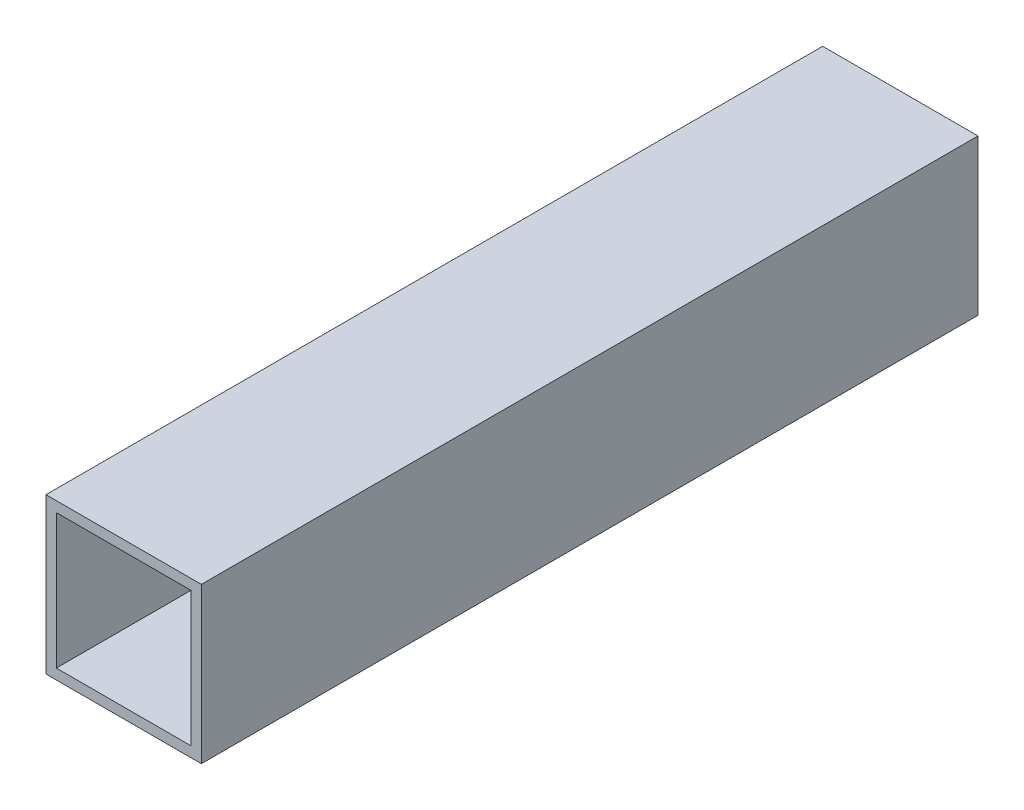
ISO-10303-21;
HEADER;
FILE_DESCRIPTION(('STEP AP214'),'2;1');
FILE_NAME('part.step','',(''),(''),'','','');
FILE_SCHEMA(('AUTOMOTIVE_DESIGN { 1 0 10303 214 1 1 1 1 }'));
ENDSEC;
DATA;
#1=APPLICATION_CONTEXT('core data for automotive mechanical design processes');
#2=APPLICATION_PROTOCOL_DEFINITION('international standard','automotive_design',2000,#1);
#3=PRODUCT_CONTEXT('',#1,'mechanical');
#4=PRODUCT('Part','Part','',(#3));
#5=PRODUCT_RELATED_PRODUCT_CATEGORY('part','',(#4));
#6=PRODUCT_DEFINITION_FORMATION('','',#4);
#7=PRODUCT_DEFINITION_CONTEXT('part definition',#1,'design');
#8=PRODUCT_DEFINITION('design','',#6,#7);
#9=PRODUCT_DEFINITION_SHAPE('','',#8);
#10=(LENGTH_UNIT() NAMED_UNIT(*) SI_UNIT(.MILLI.,.METRE.));
#11=(NAMED_UNIT(*) PLANE_ANGLE_UNIT() SI_UNIT($,.RADIAN.));
#12=(NAMED_UNIT(*) SI_UNIT($,.STERADIAN.) SOLID_ANGLE_UNIT());
#13=UNCERTAINTY_MEASURE_WITH_UNIT(LENGTH_MEASURE(1.E-05),#10,'distance_accuracy_value','');
#14=(GEOMETRIC_REPRESENTATION_CONTEXT(3) GLOBAL_UNCERTAINTY_ASSIGNED_CONTEXT((#13)) GLOBAL_UNIT_ASSIGNED_CONTEXT((#10,
#11,#12)) REPRESENTATION_CONTEXT('',''));
#15=CARTESIAN_POINT('',(0.,0.,0.));
#16=DIRECTION('',(0.,0.,1.));
#17=DIRECTION('',(1.,0.,0.));
#18=AXIS2_PLACEMENT_3D('',#15,#16,#17);
#19=CARTESIAN_POINT('',(-15.,-15.,150.));
#20=DIRECTION('',(0.,0.,1.));
#21=DIRECTION('',(1.,0.,0.));
#22=AXIS2_PLACEMENT_3D('',#19,#20,#21);
#23=PLANE('',#22);
#24=DIRECTION('',(0.,-1.,0.));
#25=VECTOR('',#24,1.);
#26=CARTESIAN_POINT('',(-15.,-15.,150.));
#27=LINE('',#26,#25);
#28=CARTESIAN_POINT('',(-15.,15.,150.));
#29=VERTEX_POINT('',#28);
#30=CARTESIAN_POINT('',(-15.,-15.,150.));
#31=VERTEX_POINT('',#30);
#32=EDGE_CURVE('E160',#29,#31,#27,.T.);
#33=ORIENTED_EDGE('',*,*,#32,.T.);
#34=DIRECTION('',(1.,0.,0.));
#35=VECTOR('',#34,1.);
#36=CARTESIAN_POINT('',(15.,-15.,150.));
#37=LINE('',#36,#35);
#38=CARTESIAN_POINT('',(15.,-15.,150.));
#39=VERTEX_POINT('',#38);
#40=EDGE_CURVE('E163',#31,#39,#37,.T.);
#41=ORIENTED_EDGE('',*,*,#40,.T.);
#42=DIRECTION('',(0.,1.,0.));
#43=VECTOR('',#42,1.);
#44=CARTESIAN_POINT('',(15.,-15.,150.));
#45=LINE('',#44,#43);
#46=CARTESIAN_POINT('',(15.,15.,150.));
#47=VERTEX_POINT('',#46);
#48=EDGE_CURVE('E166',#39,#47,#45,.T.);
#49=ORIENTED_EDGE('',*,*,#48,.T.);
#50=DIRECTION('',(-1.,0.,0.));
#51=VECTOR('',#50,1.);
#52=CARTESIAN_POINT('',(15.,15.,150.));
#53=LINE('',#52,#51);
#54=EDGE_CURVE('E168',#47,#29,#53,.T.);
#55=ORIENTED_EDGE('',*,*,#54,.T.);
#56=EDGE_LOOP('',(#33,#41,#49,#55));
#57=FACE_BOUND('',#56,.T.);
#58=DIRECTION('',(1.,0.,0.));
#59=VECTOR('',#58,1.);
#60=CARTESIAN_POINT('',(15.,-13.,150.));
#61=LINE('',#60,#59);
#62=CARTESIAN_POINT('',(-13.,-13.,150.));
#63=VERTEX_POINT('',#62);
#64=CARTESIAN_POINT('',(13.,-13.,150.));
#65=VERTEX_POINT('',#64);
#66=EDGE_CURVE('E132',#63,#65,#61,.T.);
#67=ORIENTED_EDGE('',*,*,#66,.F.);
#68=DIRECTION('',(0.,-1.,0.));
#69=VECTOR('',#68,1.);
#70=CARTESIAN_POINT('',(-13.,-15.,150.));
#71=LINE('',#70,#69);
#72=CARTESIAN_POINT('',(-13.,13.,150.));
#73=VERTEX_POINT('',#72);
#74=EDGE_CURVE('E124',#73,#63,#71,.T.);
#75=ORIENTED_EDGE('',*,*,#74,.F.);
#76=DIRECTION('',(-1.,0.,0.));
#77=VECTOR('',#76,1.);
#78=CARTESIAN_POINT('',(15.,13.,150.));
#79=LINE('',#78,#77);
#80=CARTESIAN_POINT('',(13.,13.,150.));
#81=VERTEX_POINT('',#80);
#82=EDGE_CURVE('E146',#81,#73,#79,.T.);
#83=ORIENTED_EDGE('',*,*,#82,.F.);
#84=DIRECTION('',(0.,1.,0.));
#85=VECTOR('',#84,1.);
#86=CARTESIAN_POINT('',(13.,-15.,150.));
#87=LINE('',#86,#85);
#88=EDGE_CURVE('E144',#65,#81,#87,.T.);
#89=ORIENTED_EDGE('',*,*,#88,.F.);
#90=EDGE_LOOP('',(#67,#75,#83,#89));
#91=FACE_BOUND('',#90,.T.);
#92=ADVANCED_FACE('F59',(#57,#91),#23,.T.);
#93=CARTESIAN_POINT('',(-15.,-15.,0.));
#94=DIRECTION('',(0.,0.,1.));
#95=DIRECTION('',(1.,0.,0.));
#96=AXIS2_PLACEMENT_3D('',#93,#94,#95);
#97=PLANE('',#96);
#98=DIRECTION('',(0.,-1.,0.));
#99=VECTOR('',#98,1.);
#100=CARTESIAN_POINT('',(-15.,-15.,0.));
#101=LINE('',#100,#99);
#102=CARTESIAN_POINT('',(-15.,15.,0.));
#103=VERTEX_POINT('',#102);
#104=CARTESIAN_POINT('',(-15.,-15.,0.));
#105=VERTEX_POINT('',#104);
#106=EDGE_CURVE('E140',#103,#105,#101,.T.);
#107=ORIENTED_EDGE('',*,*,#106,.F.);
#108=DIRECTION('',(-1.,0.,0.));
#109=VECTOR('',#108,1.);
#110=CARTESIAN_POINT('',(15.,15.,0.));
#111=LINE('',#110,#109);
#112=CARTESIAN_POINT('',(15.,15.,0.));
#113=VERTEX_POINT('',#112);
#114=EDGE_CURVE('E164',#113,#103,#111,.T.);
#115=ORIENTED_EDGE('',*,*,#114,.F.);
#116=DIRECTION('',(0.,1.,0.));
#117=VECTOR('',#116,1.);
#118=CARTESIAN_POINT('',(15.,-15.,0.));
#119=LINE('',#118,#117);
#120=CARTESIAN_POINT('',(15.,-15.,0.));
#121=VERTEX_POINT('',#120);
#122=EDGE_CURVE('E175',#121,#113,#119,.T.);
#123=ORIENTED_EDGE('',*,*,#122,.F.);
#124=DIRECTION('',(1.,0.,0.));
#125=VECTOR('',#124,1.);
#126=CARTESIAN_POINT('',(15.,-15.,0.));
#127=LINE('',#126,#125);
#128=EDGE_CURVE('E173',#105,#121,#127,.T.);
#129=ORIENTED_EDGE('',*,*,#128,.F.);
#130=EDGE_LOOP('',(#107,#115,#123,#129));
#131=FACE_BOUND('',#130,.T.);
#132=DIRECTION('',(0.,-1.,0.));
#133=VECTOR('',#132,1.);
#134=CARTESIAN_POINT('',(-13.,-15.,0.));
#135=LINE('',#134,#133);
#136=CARTESIAN_POINT('',(-13.,13.,0.));
#137=VERTEX_POINT('',#136);
#138=CARTESIAN_POINT('',(-13.,-13.,0.));
#139=VERTEX_POINT('',#138);
#140=EDGE_CURVE('E82',#137,#139,#135,.T.);
#141=ORIENTED_EDGE('',*,*,#140,.T.);
#142=DIRECTION('',(1.,0.,0.));
#143=VECTOR('',#142,1.);
#144=CARTESIAN_POINT('',(15.,-13.,0.));
#145=LINE('',#144,#143);
#146=CARTESIAN_POINT('',(13.,-13.,0.));
#147=VERTEX_POINT('',#146);
#148=EDGE_CURVE('E139',#139,#147,#145,.T.);
#149=ORIENTED_EDGE('',*,*,#148,.T.);
#150=DIRECTION('',(0.,1.,0.));
#151=VECTOR('',#150,1.);
#152=CARTESIAN_POINT('',(13.,-15.,0.));
#153=LINE('',#152,#151);
#154=CARTESIAN_POINT('',(13.,13.,0.));
#155=VERTEX_POINT('',#154);
#156=EDGE_CURVE('E152',#147,#155,#153,.T.);
#157=ORIENTED_EDGE('',*,*,#156,.T.);
#158=DIRECTION('',(-1.,0.,0.));
#159=VECTOR('',#158,1.);
#160=CARTESIAN_POINT('',(15.,13.,0.));
#161=LINE('',#160,#159);
#162=EDGE_CURVE('E133',#155,#137,#161,.T.);
#163=ORIENTED_EDGE('',*,*,#162,.T.);
#164=EDGE_LOOP('',(#141,#149,#157,#163));
#165=FACE_BOUND('',#164,.T.);
#166=ADVANCED_FACE('F193',(#131,#165),#97,.F.);
#167=CARTESIAN_POINT('',(-15.,-15.,150.));
#168=DIRECTION('',(1.,0.,0.));
#169=DIRECTION('',(0.,0.,-1.));
#170=AXIS2_PLACEMENT_3D('',#167,#168,#169);
#171=PLANE('',#170);
#172=ORIENTED_EDGE('',*,*,#106,.T.);
#173=DIRECTION('',(0.,0.,-1.));
#174=VECTOR('',#173,1.);
#175=CARTESIAN_POINT('',(-15.,-15.,150.));
#176=LINE('',#175,#174);
#177=EDGE_CURVE('E12',#31,#105,#176,.T.);
#178=ORIENTED_EDGE('',*,*,#177,.F.);
#179=ORIENTED_EDGE('',*,*,#32,.F.);
#180=DIRECTION('',(0.,0.,-1.));
#181=VECTOR('',#180,1.);
#182=CARTESIAN_POINT('',(-15.,15.,150.));
#183=LINE('',#182,#181);
#184=EDGE_CURVE('E170',#29,#103,#183,.T.);
#185=ORIENTED_EDGE('',*,*,#184,.T.);
#186=EDGE_LOOP('',(#172,#178,#179,#185));
#187=FACE_BOUND('',#186,.T.);
#188=ADVANCED_FACE('F61',(#187),#171,.F.);
#189=CARTESIAN_POINT('',(15.,-15.,150.));
#190=DIRECTION('',(0.,1.,0.));
#191=DIRECTION('',(-1.,0.,0.));
#192=AXIS2_PLACEMENT_3D('',#189,#190,#191);
#193=PLANE('',#192);
#194=ORIENTED_EDGE('',*,*,#128,.T.);
#195=DIRECTION('',(0.,0.,-1.));
#196=VECTOR('',#195,1.);
#197=CARTESIAN_POINT('',(15.,-15.,150.));
#198=LINE('',#197,#196);
#199=EDGE_CURVE('E67',#39,#121,#198,.T.);
#200=ORIENTED_EDGE('',*,*,#199,.F.);
#201=ORIENTED_EDGE('',*,*,#40,.F.);
#202=ORIENTED_EDGE('',*,*,#177,.T.);
#203=EDGE_LOOP('',(#194,#200,#201,#202));
#204=FACE_BOUND('',#203,.T.);
#205=ADVANCED_FACE('F203',(#204),#193,.F.);
#206=CARTESIAN_POINT('',(15.,-15.,150.));
#207=DIRECTION('',(-1.,0.,0.));
#208=DIRECTION('',(0.,0.,1.));
#209=AXIS2_PLACEMENT_3D('',#206,#207,#208);
#210=PLANE('',#209);
#211=ORIENTED_EDGE('',*,*,#122,.T.);
#212=DIRECTION('',(0.,0.,-1.));
#213=VECTOR('',#212,1.);
#214=CARTESIAN_POINT('',(15.,15.,150.));
#215=LINE('',#214,#213);
#216=EDGE_CURVE('E180',#47,#113,#215,.T.);
#217=ORIENTED_EDGE('',*,*,#216,.F.);
#218=ORIENTED_EDGE('',*,*,#48,.F.);
#219=ORIENTED_EDGE('',*,*,#199,.T.);
#220=EDGE_LOOP('',(#211,#217,#218,#219));
#221=FACE_BOUND('',#220,.T.);
#222=ADVANCED_FACE('F187',(#221),#210,.F.);
#223=CARTESIAN_POINT('',(15.,15.,150.));
#224=DIRECTION('',(0.,-1.,0.));
#225=DIRECTION('',(1.,0.,0.));
#226=AXIS2_PLACEMENT_3D('',#223,#224,#225);
#227=PLANE('',#226);
#228=ORIENTED_EDGE('',*,*,#114,.T.);
#229=ORIENTED_EDGE('',*,*,#184,.F.);
#230=ORIENTED_EDGE('',*,*,#54,.F.);
#231=ORIENTED_EDGE('',*,*,#216,.T.);
#232=EDGE_LOOP('',(#228,#229,#230,#231));
#233=FACE_BOUND('',#232,.T.);
#234=ADVANCED_FACE('F197',(#233),#227,.F.);
#235=CARTESIAN_POINT('',(-13.,-15.,150.));
#236=DIRECTION('',(1.,0.,0.));
#237=DIRECTION('',(0.,0.,-1.));
#238=AXIS2_PLACEMENT_3D('',#235,#236,#237);
#239=PLANE('',#238);
#240=ORIENTED_EDGE('',*,*,#140,.F.);
#241=DIRECTION('',(0.,0.,-1.));
#242=VECTOR('',#241,1.);
#243=CARTESIAN_POINT('',(-13.,13.,150.));
#244=LINE('',#243,#242);
#245=EDGE_CURVE('E128',#73,#137,#244,.T.);
#246=ORIENTED_EDGE('',*,*,#245,.F.);
#247=ORIENTED_EDGE('',*,*,#74,.T.);
#248=DIRECTION('',(0.,0.,-1.));
#249=VECTOR('',#248,1.);
#250=CARTESIAN_POINT('',(-13.,-13.,150.));
#251=LINE('',#250,#249);
#252=EDGE_CURVE('E127',#63,#139,#251,.T.);
#253=ORIENTED_EDGE('',*,*,#252,.T.);
#254=EDGE_LOOP('',(#240,#246,#247,#253));
#255=FACE_BOUND('',#254,.T.);
#256=ADVANCED_FACE('F126',(#255),#239,.T.);
#257=CARTESIAN_POINT('',(15.,-13.,150.));
#258=DIRECTION('',(0.,1.,0.));
#259=DIRECTION('',(-1.,0.,0.));
#260=AXIS2_PLACEMENT_3D('',#257,#258,#259);
#261=PLANE('',#260);
#262=ORIENTED_EDGE('',*,*,#148,.F.);
#263=ORIENTED_EDGE('',*,*,#252,.F.);
#264=ORIENTED_EDGE('',*,*,#66,.T.);
#265=DIRECTION('',(0.,0.,-1.));
#266=VECTOR('',#265,1.);
#267=CARTESIAN_POINT('',(13.,-13.,150.));
#268=LINE('',#267,#266);
#269=EDGE_CURVE('E141',#65,#147,#268,.T.);
#270=ORIENTED_EDGE('',*,*,#269,.T.);
#271=EDGE_LOOP('',(#262,#263,#264,#270));
#272=FACE_BOUND('',#271,.T.);
#273=ADVANCED_FACE('F136',(#272),#261,.T.);
#274=CARTESIAN_POINT('',(13.,-15.,150.));
#275=DIRECTION('',(-1.,0.,0.));
#276=DIRECTION('',(0.,0.,1.));
#277=AXIS2_PLACEMENT_3D('',#274,#275,#276);
#278=PLANE('',#277);
#279=ORIENTED_EDGE('',*,*,#156,.F.);
#280=ORIENTED_EDGE('',*,*,#269,.F.);
#281=ORIENTED_EDGE('',*,*,#88,.T.);
#282=DIRECTION('',(0.,0.,-1.));
#283=VECTOR('',#282,1.);
#284=CARTESIAN_POINT('',(13.,13.,150.));
#285=LINE('',#284,#283);
#286=EDGE_CURVE('E74',#81,#155,#285,.T.);
#287=ORIENTED_EDGE('',*,*,#286,.T.);
#288=EDGE_LOOP('',(#279,#280,#281,#287));
#289=FACE_BOUND('',#288,.T.);
#290=ADVANCED_FACE('F226',(#289),#278,.T.);
#291=CARTESIAN_POINT('',(15.,13.,150.));
#292=DIRECTION('',(0.,-1.,0.));
#293=DIRECTION('',(1.,0.,0.));
#294=AXIS2_PLACEMENT_3D('',#291,#292,#293);
#295=PLANE('',#294);
#296=ORIENTED_EDGE('',*,*,#162,.F.);
#297=ORIENTED_EDGE('',*,*,#286,.F.);
#298=ORIENTED_EDGE('',*,*,#82,.T.);
#299=ORIENTED_EDGE('',*,*,#245,.T.);
#300=EDGE_LOOP('',(#296,#297,#298,#299));
#301=FACE_BOUND('',#300,.T.);
#302=ADVANCED_FACE('F230',(#301),#295,.T.);
#303=CLOSED_SHELL('',(#92,#166,#188,#205,#222,#234,#256,#273,#290,#302));
#304=MANIFOLD_SOLID_BREP('B2',#303);
#305=ADVANCED_BREP_SHAPE_REPRESENTATION('',(#18,#304),#14);
#306=SHAPE_DEFINITION_REPRESENTATION(#9,#305);
ENDSEC;
END-ISO-10303-21;
